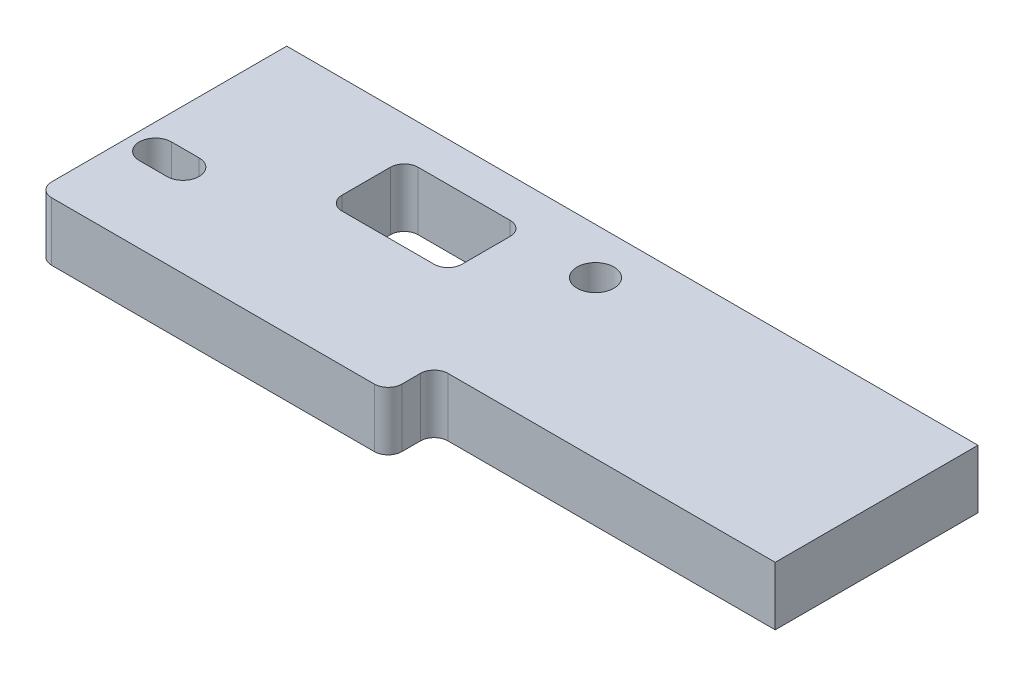
ISO-10303-21;
HEADER;
FILE_DESCRIPTION(('STEP AP214'),'2;1');
FILE_NAME('part.step','',(''),(''),'','','');
FILE_SCHEMA(('AUTOMOTIVE_DESIGN { 1 0 10303 214 1 1 1 1 }'));
ENDSEC;
DATA;
#1=APPLICATION_CONTEXT('core data for automotive mechanical design processes');
#2=APPLICATION_PROTOCOL_DEFINITION('international standard','automotive_design',2000,#1);
#3=PRODUCT_CONTEXT('',#1,'mechanical');
#4=PRODUCT('Part','Part','',(#3));
#5=PRODUCT_RELATED_PRODUCT_CATEGORY('part','',(#4));
#6=PRODUCT_DEFINITION_FORMATION('','',#4);
#7=PRODUCT_DEFINITION_CONTEXT('part definition',#1,'design');
#8=PRODUCT_DEFINITION('design','',#6,#7);
#9=PRODUCT_DEFINITION_SHAPE('','',#8);
#10=(LENGTH_UNIT() NAMED_UNIT(*) SI_UNIT(.MILLI.,.METRE.));
#11=(NAMED_UNIT(*) PLANE_ANGLE_UNIT() SI_UNIT($,.RADIAN.));
#12=(NAMED_UNIT(*) SI_UNIT($,.STERADIAN.) SOLID_ANGLE_UNIT());
#13=UNCERTAINTY_MEASURE_WITH_UNIT(LENGTH_MEASURE(1.E-05),#10,'distance_accuracy_value','');
#14=(GEOMETRIC_REPRESENTATION_CONTEXT(3) GLOBAL_UNCERTAINTY_ASSIGNED_CONTEXT((#13)) GLOBAL_UNIT_ASSIGNED_CONTEXT((#10,
#11,#12)) REPRESENTATION_CONTEXT('',''));
#15=CARTESIAN_POINT('',(0.,0.,0.));
#16=DIRECTION('',(0.,0.,1.));
#17=DIRECTION('',(1.,0.,0.));
#18=AXIS2_PLACEMENT_3D('',#15,#16,#17);
#19=CARTESIAN_POINT('',(5.75,6.35,-10.));
#20=DIRECTION('',(0.,-1.,0.));
#21=DIRECTION('',(0.,0.,-1.));
#22=AXIS2_PLACEMENT_3D('',#19,#20,#21);
#23=CYLINDRICAL_SURFACE('',#22,1.75);
#24=CARTESIAN_POINT('',(5.75,0.,-10.));
#25=DIRECTION('',(0.,1.,0.));
#26=DIRECTION('',(0.,0.,1.));
#27=AXIS2_PLACEMENT_3D('',#24,#25,#26);
#28=CIRCLE('',#27,1.75);
#29=CARTESIAN_POINT('',(5.75,0.,-8.25));
#30=VERTEX_POINT('',#29);
#31=CARTESIAN_POINT('',(5.75,0.,-11.75));
#32=VERTEX_POINT('',#31);
#33=EDGE_CURVE('E221',#30,#32,#28,.T.);
#34=ORIENTED_EDGE('',*,*,#33,.F.);
#35=DIRECTION('',(0.,-1.,0.));
#36=VECTOR('',#35,1.);
#37=CARTESIAN_POINT('',(5.75,6.35,-8.25));
#38=LINE('',#37,#36);
#39=CARTESIAN_POINT('',(5.75,6.35,-8.25));
#40=VERTEX_POINT('',#39);
#41=EDGE_CURVE('E230',#40,#30,#38,.T.);
#42=ORIENTED_EDGE('',*,*,#41,.F.);
#43=CARTESIAN_POINT('',(5.75,6.35,-10.));
#44=DIRECTION('',(0.,1.,0.));
#45=DIRECTION('',(0.,0.,1.));
#46=AXIS2_PLACEMENT_3D('',#43,#44,#45);
#47=CIRCLE('',#46,1.75);
#48=CARTESIAN_POINT('',(5.75,6.35,-11.75));
#49=VERTEX_POINT('',#48);
#50=EDGE_CURVE('E210',#40,#49,#47,.T.);
#51=ORIENTED_EDGE('',*,*,#50,.T.);
#52=DIRECTION('',(0.,-1.,0.));
#53=VECTOR('',#52,1.);
#54=CARTESIAN_POINT('',(5.75,6.35,-11.75));
#55=LINE('',#54,#53);
#56=EDGE_CURVE('E228',#49,#32,#55,.T.);
#57=ORIENTED_EDGE('',*,*,#56,.T.);
#58=EDGE_LOOP('',(#34,#42,#51,#57));
#59=FACE_BOUND('',#58,.T.);
#60=ADVANCED_FACE('F32',(#59),#23,.F.);
#61=CARTESIAN_POINT('',(2.75,6.35,-8.25));
#62=DIRECTION('',(0.,0.,-1.));
#63=DIRECTION('',(-1.,0.,0.));
#64=AXIS2_PLACEMENT_3D('',#61,#62,#63);
#65=PLANE('',#64);
#66=DIRECTION('',(1.,0.,0.));
#67=VECTOR('',#66,1.);
#68=CARTESIAN_POINT('',(2.75,0.,-8.25));
#69=LINE('',#68,#67);
#70=CARTESIAN_POINT('',(2.75,0.,-8.25));
#71=VERTEX_POINT('',#70);
#72=EDGE_CURVE('E218',#71,#30,#69,.T.);
#73=ORIENTED_EDGE('',*,*,#72,.F.);
#74=DIRECTION('',(0.,-1.,0.));
#75=VECTOR('',#74,1.);
#76=CARTESIAN_POINT('',(2.75,6.35,-8.25));
#77=LINE('',#76,#75);
#78=CARTESIAN_POINT('',(2.75,6.35,-8.25));
#79=VERTEX_POINT('',#78);
#80=EDGE_CURVE('E232',#79,#71,#77,.T.);
#81=ORIENTED_EDGE('',*,*,#80,.F.);
#82=DIRECTION('',(1.,0.,0.));
#83=VECTOR('',#82,1.);
#84=CARTESIAN_POINT('',(2.75,6.35,-8.25));
#85=LINE('',#84,#83);
#86=EDGE_CURVE('E207',#79,#40,#85,.T.);
#87=ORIENTED_EDGE('',*,*,#86,.T.);
#88=ORIENTED_EDGE('',*,*,#41,.T.);
#89=EDGE_LOOP('',(#73,#81,#87,#88));
#90=FACE_BOUND('',#89,.T.);
#91=ADVANCED_FACE('F371',(#90),#65,.T.);
#92=CARTESIAN_POINT('',(2.75,6.35,-10.));
#93=DIRECTION('',(0.,-1.,0.));
#94=DIRECTION('',(0.,0.,-1.));
#95=AXIS2_PLACEMENT_3D('',#92,#93,#94);
#96=CYLINDRICAL_SURFACE('',#95,1.75);
#97=CARTESIAN_POINT('',(2.75,0.,-10.));
#98=DIRECTION('',(0.,1.,0.));
#99=DIRECTION('',(0.,0.,1.));
#100=AXIS2_PLACEMENT_3D('',#97,#98,#99);
#101=CIRCLE('',#100,1.75);
#102=CARTESIAN_POINT('',(2.75,0.,-11.75));
#103=VERTEX_POINT('',#102);
#104=EDGE_CURVE('E204',#103,#71,#101,.T.);
#105=ORIENTED_EDGE('',*,*,#104,.F.);
#106=DIRECTION('',(0.,-1.,0.));
#107=VECTOR('',#106,1.);
#108=CARTESIAN_POINT('',(2.75,6.35,-11.75));
#109=LINE('',#108,#107);
#110=CARTESIAN_POINT('',(2.75,6.35,-11.75));
#111=VERTEX_POINT('',#110);
#112=EDGE_CURVE('E215',#111,#103,#109,.T.);
#113=ORIENTED_EDGE('',*,*,#112,.F.);
#114=CARTESIAN_POINT('',(2.75,6.35,-10.));
#115=DIRECTION('',(0.,1.,0.));
#116=DIRECTION('',(0.,0.,1.));
#117=AXIS2_PLACEMENT_3D('',#114,#115,#116);
#118=CIRCLE('',#117,1.75);
#119=EDGE_CURVE('E205',#111,#79,#118,.T.);
#120=ORIENTED_EDGE('',*,*,#119,.T.);
#121=ORIENTED_EDGE('',*,*,#80,.T.);
#122=EDGE_LOOP('',(#105,#113,#120,#121));
#123=FACE_BOUND('',#122,.T.);
#124=ADVANCED_FACE('F378',(#123),#96,.F.);
#125=CARTESIAN_POINT('',(2.75,6.35,-11.75));
#126=DIRECTION('',(0.,0.,1.));
#127=DIRECTION('',(1.,0.,0.));
#128=AXIS2_PLACEMENT_3D('',#125,#126,#127);
#129=PLANE('',#128);
#130=DIRECTION('',(-1.,0.,0.));
#131=VECTOR('',#130,1.);
#132=CARTESIAN_POINT('',(2.75,0.,-11.75));
#133=LINE('',#132,#131);
#134=EDGE_CURVE('E208',#32,#103,#133,.T.);
#135=ORIENTED_EDGE('',*,*,#134,.F.);
#136=ORIENTED_EDGE('',*,*,#56,.F.);
#137=DIRECTION('',(-1.,0.,0.));
#138=VECTOR('',#137,1.);
#139=CARTESIAN_POINT('',(2.75,6.35,-11.75));
#140=LINE('',#139,#138);
#141=EDGE_CURVE('E213',#49,#111,#140,.T.);
#142=ORIENTED_EDGE('',*,*,#141,.T.);
#143=ORIENTED_EDGE('',*,*,#112,.T.);
#144=EDGE_LOOP('',(#135,#136,#142,#143));
#145=FACE_BOUND('',#144,.T.);
#146=ADVANCED_FACE('F383',(#145),#129,.T.);
#147=CARTESIAN_POINT('',(38.5,6.35,-22.));
#148=DIRECTION('',(0.,-1.,0.));
#149=DIRECTION('',(0.,0.,-1.));
#150=AXIS2_PLACEMENT_3D('',#147,#148,#149);
#151=CYLINDRICAL_SURFACE('',#150,2.);
#152=CARTESIAN_POINT('',(38.5,6.35,-22.));
#153=DIRECTION('',(0.,1.,0.));
#154=DIRECTION('',(0.,0.,1.));
#155=AXIS2_PLACEMENT_3D('',#152,#153,#154);
#156=CIRCLE('',#155,2.);
#157=CARTESIAN_POINT('',(38.5,6.35,-20.));
#158=VERTEX_POINT('',#157);
#159=EDGE_CURVE('E236',#158,#158,#156,.T.);
#160=ORIENTED_EDGE('',*,*,#159,.T.);
#161=EDGE_LOOP('',(#160));
#162=FACE_BOUND('',#161,.T.);
#163=CARTESIAN_POINT('',(38.5,0.,-22.));
#164=DIRECTION('',(0.,1.,0.));
#165=DIRECTION('',(0.,0.,1.));
#166=AXIS2_PLACEMENT_3D('',#163,#164,#165);
#167=CIRCLE('',#166,2.);
#168=CARTESIAN_POINT('',(38.5,0.,-20.));
#169=VERTEX_POINT('',#168);
#170=EDGE_CURVE('E235',#169,#169,#167,.T.);
#171=ORIENTED_EDGE('',*,*,#170,.F.);
#172=EDGE_LOOP('',(#171));
#173=FACE_BOUND('',#172,.T.);
#174=ADVANCED_FACE('F389',(#162,#173),#151,.F.);
#175=CARTESIAN_POINT('',(28.5,6.35,-16.));
#176=DIRECTION('',(0.,1.,0.));
#177=DIRECTION('',(0.,0.,1.));
#178=AXIS2_PLACEMENT_3D('',#175,#176,#177);
#179=CYLINDRICAL_SURFACE('',#178,1.5);
#180=CARTESIAN_POINT('',(28.5,6.35,-16.));
#181=DIRECTION('',(0.,-1.,0.));
#182=DIRECTION('',(0.,0.,-1.));
#183=AXIS2_PLACEMENT_3D('',#180,#181,#182);
#184=CIRCLE('',#183,1.5);
#185=CARTESIAN_POINT('',(30.,6.35,-16.));
#186=VERTEX_POINT('',#185);
#187=CARTESIAN_POINT('',(28.5,6.35,-14.5));
#188=VERTEX_POINT('',#187);
#189=EDGE_CURVE('E340',#186,#188,#184,.T.);
#190=ORIENTED_EDGE('',*,*,#189,.F.);
#191=DIRECTION('',(0.,-1.,0.));
#192=VECTOR('',#191,1.);
#193=CARTESIAN_POINT('',(30.,6.35,-16.));
#194=LINE('',#193,#192);
#195=CARTESIAN_POINT('',(30.,0.,-16.));
#196=VERTEX_POINT('',#195);
#197=EDGE_CURVE('E298',#196,#186,#194,.F.);
#198=ORIENTED_EDGE('',*,*,#197,.F.);
#199=CARTESIAN_POINT('',(28.5,0.,-16.));
#200=DIRECTION('',(0.,-1.,0.));
#201=DIRECTION('',(0.,0.,-1.));
#202=AXIS2_PLACEMENT_3D('',#199,#200,#201);
#203=CIRCLE('',#202,1.5);
#204=CARTESIAN_POINT('',(28.5,0.,-14.5));
#205=VERTEX_POINT('',#204);
#206=EDGE_CURVE('E338',#205,#196,#203,.F.);
#207=ORIENTED_EDGE('',*,*,#206,.F.);
#208=DIRECTION('',(0.,-1.,0.));
#209=VECTOR('',#208,1.);
#210=CARTESIAN_POINT('',(28.5,0.,-14.5));
#211=LINE('',#210,#209);
#212=EDGE_CURVE('E288',#188,#205,#211,.T.);
#213=ORIENTED_EDGE('',*,*,#212,.F.);
#214=EDGE_LOOP('',(#190,#198,#207,#213));
#215=FACE_BOUND('',#214,.T.);
#216=ADVANCED_FACE('F392',(#215),#179,.F.);
#217=CARTESIAN_POINT('',(17.,6.35,-14.5));
#218=DIRECTION('',(0.,0.,-1.));
#219=DIRECTION('',(-1.,0.,0.));
#220=AXIS2_PLACEMENT_3D('',#217,#218,#219);
#221=PLANE('',#220);
#222=DIRECTION('',(1.,0.,0.));
#223=VECTOR('',#222,1.);
#224=CARTESIAN_POINT('',(17.,0.,-14.5));
#225=LINE('',#224,#223);
#226=CARTESIAN_POINT('',(18.5,0.,-14.5));
#227=VERTEX_POINT('',#226);
#228=EDGE_CURVE('E257',#227,#205,#225,.T.);
#229=ORIENTED_EDGE('',*,*,#228,.F.);
#230=DIRECTION('',(0.,-1.,0.));
#231=VECTOR('',#230,1.);
#232=CARTESIAN_POINT('',(18.5,6.35,-14.5));
#233=LINE('',#232,#231);
#234=CARTESIAN_POINT('',(18.5,6.35,-14.5));
#235=VERTEX_POINT('',#234);
#236=EDGE_CURVE('E291',#227,#235,#233,.F.);
#237=ORIENTED_EDGE('',*,*,#236,.T.);
#238=DIRECTION('',(1.,0.,0.));
#239=VECTOR('',#238,1.);
#240=CARTESIAN_POINT('',(17.,6.35,-14.5));
#241=LINE('',#240,#239);
#242=EDGE_CURVE('E245',#235,#188,#241,.T.);
#243=ORIENTED_EDGE('',*,*,#242,.T.);
#244=ORIENTED_EDGE('',*,*,#212,.T.);
#245=EDGE_LOOP('',(#229,#237,#243,#244));
#246=FACE_BOUND('',#245,.T.);
#247=ADVANCED_FACE('F405',(#246),#221,.T.);
#248=CARTESIAN_POINT('',(18.5,6.35,-16.));
#249=DIRECTION('',(0.,1.,0.));
#250=DIRECTION('',(0.,0.,1.));
#251=AXIS2_PLACEMENT_3D('',#248,#249,#250);
#252=CYLINDRICAL_SURFACE('',#251,1.5);
#253=CARTESIAN_POINT('',(18.5,6.35,-16.));
#254=DIRECTION('',(0.,-1.,0.));
#255=DIRECTION('',(0.,0.,-1.));
#256=AXIS2_PLACEMENT_3D('',#253,#254,#255);
#257=CIRCLE('',#256,1.5);
#258=CARTESIAN_POINT('',(17.,6.35,-16.));
#259=VERTEX_POINT('',#258);
#260=EDGE_CURVE('E328',#235,#259,#257,.T.);
#261=ORIENTED_EDGE('',*,*,#260,.F.);
#262=ORIENTED_EDGE('',*,*,#236,.F.);
#263=CARTESIAN_POINT('',(18.5,0.,-16.));
#264=DIRECTION('',(0.,-1.,0.));
#265=DIRECTION('',(0.,0.,-1.));
#266=AXIS2_PLACEMENT_3D('',#263,#264,#265);
#267=CIRCLE('',#266,1.5);
#268=CARTESIAN_POINT('',(17.,0.,-16.));
#269=VERTEX_POINT('',#268);
#270=EDGE_CURVE('E326',#269,#227,#267,.F.);
#271=ORIENTED_EDGE('',*,*,#270,.F.);
#272=DIRECTION('',(0.,-1.,0.));
#273=VECTOR('',#272,1.);
#274=CARTESIAN_POINT('',(17.,0.,-16.));
#275=LINE('',#274,#273);
#276=EDGE_CURVE('E285',#259,#269,#275,.T.);
#277=ORIENTED_EDGE('',*,*,#276,.F.);
#278=EDGE_LOOP('',(#261,#262,#271,#277));
#279=FACE_BOUND('',#278,.T.);
#280=ADVANCED_FACE('F408',(#279),#252,.F.);
#281=CARTESIAN_POINT('',(17.,6.35,-22.75));
#282=DIRECTION('',(1.,0.,0.));
#283=DIRECTION('',(0.,0.,-1.));
#284=AXIS2_PLACEMENT_3D('',#281,#282,#283);
#285=PLANE('',#284);
#286=DIRECTION('',(0.,0.,1.));
#287=VECTOR('',#286,1.);
#288=CARTESIAN_POINT('',(17.,6.35,-22.75));
#289=LINE('',#288,#287);
#290=CARTESIAN_POINT('',(17.,6.35,-21.25));
#291=VERTEX_POINT('',#290);
#292=EDGE_CURVE('E242',#291,#259,#289,.T.);
#293=ORIENTED_EDGE('',*,*,#292,.T.);
#294=ORIENTED_EDGE('',*,*,#276,.T.);
#295=DIRECTION('',(0.,0.,1.));
#296=VECTOR('',#295,1.);
#297=CARTESIAN_POINT('',(17.,0.,-22.75));
#298=LINE('',#297,#296);
#299=CARTESIAN_POINT('',(17.,0.,-21.25));
#300=VERTEX_POINT('',#299);
#301=EDGE_CURVE('E239',#300,#269,#298,.T.);
#302=ORIENTED_EDGE('',*,*,#301,.F.);
#303=DIRECTION('',(0.,-1.,0.));
#304=VECTOR('',#303,1.);
#305=CARTESIAN_POINT('',(17.,6.35,-21.25));
#306=LINE('',#305,#304);
#307=EDGE_CURVE('E276',#300,#291,#306,.F.);
#308=ORIENTED_EDGE('',*,*,#307,.T.);
#309=EDGE_LOOP('',(#293,#294,#302,#308));
#310=FACE_BOUND('',#309,.T.);
#311=ADVANCED_FACE('F410',(#310),#285,.T.);
#312=CARTESIAN_POINT('',(18.5,6.35,-21.25));
#313=DIRECTION('',(0.,1.,0.));
#314=DIRECTION('',(0.,0.,1.));
#315=AXIS2_PLACEMENT_3D('',#312,#313,#314);
#316=CYLINDRICAL_SURFACE('',#315,1.5);
#317=CARTESIAN_POINT('',(18.5,6.35,-21.25));
#318=DIRECTION('',(0.,-1.,0.));
#319=DIRECTION('',(0.,0.,-1.));
#320=AXIS2_PLACEMENT_3D('',#317,#318,#319);
#321=CIRCLE('',#320,1.5);
#322=CARTESIAN_POINT('',(18.5,6.35,-22.75));
#323=VERTEX_POINT('',#322);
#324=EDGE_CURVE('E332',#291,#323,#321,.T.);
#325=ORIENTED_EDGE('',*,*,#324,.F.);
#326=ORIENTED_EDGE('',*,*,#307,.F.);
#327=CARTESIAN_POINT('',(18.5,0.,-21.25));
#328=DIRECTION('',(0.,-1.,0.));
#329=DIRECTION('',(0.,0.,-1.));
#330=AXIS2_PLACEMENT_3D('',#327,#328,#329);
#331=CIRCLE('',#330,1.5);
#332=CARTESIAN_POINT('',(18.5,0.,-22.75));
#333=VERTEX_POINT('',#332);
#334=EDGE_CURVE('E330',#333,#300,#331,.F.);
#335=ORIENTED_EDGE('',*,*,#334,.F.);
#336=DIRECTION('',(0.,-1.,0.));
#337=VECTOR('',#336,1.);
#338=CARTESIAN_POINT('',(18.5,0.,-22.75));
#339=LINE('',#338,#337);
#340=EDGE_CURVE('E295',#323,#333,#339,.T.);
#341=ORIENTED_EDGE('',*,*,#340,.F.);
#342=EDGE_LOOP('',(#325,#326,#335,#341));
#343=FACE_BOUND('',#342,.T.);
#344=ADVANCED_FACE('F398',(#343),#316,.F.);
#345=CARTESIAN_POINT('',(17.,6.35,-22.75));
#346=DIRECTION('',(0.,0.,1.));
#347=DIRECTION('',(1.,0.,0.));
#348=AXIS2_PLACEMENT_3D('',#345,#346,#347);
#349=PLANE('',#348);
#350=DIRECTION('',(-1.,0.,0.));
#351=VECTOR('',#350,1.);
#352=CARTESIAN_POINT('',(17.,6.35,-22.75));
#353=LINE('',#352,#351);
#354=CARTESIAN_POINT('',(28.5,6.35,-22.75));
#355=VERTEX_POINT('',#354);
#356=EDGE_CURVE('E252',#355,#323,#353,.T.);
#357=ORIENTED_EDGE('',*,*,#356,.T.);
#358=ORIENTED_EDGE('',*,*,#340,.T.);
#359=DIRECTION('',(-1.,0.,0.));
#360=VECTOR('',#359,1.);
#361=CARTESIAN_POINT('',(17.,0.,-22.75));
#362=LINE('',#361,#360);
#363=CARTESIAN_POINT('',(28.5,0.,-22.75));
#364=VERTEX_POINT('',#363);
#365=EDGE_CURVE('E246',#364,#333,#362,.T.);
#366=ORIENTED_EDGE('',*,*,#365,.F.);
#367=DIRECTION('',(0.,-1.,0.));
#368=VECTOR('',#367,1.);
#369=CARTESIAN_POINT('',(28.5,6.35,-22.75));
#370=LINE('',#369,#368);
#371=EDGE_CURVE('E293',#364,#355,#370,.F.);
#372=ORIENTED_EDGE('',*,*,#371,.T.);
#373=EDGE_LOOP('',(#357,#358,#366,#372));
#374=FACE_BOUND('',#373,.T.);
#375=ADVANCED_FACE('F394',(#374),#349,.T.);
#376=CARTESIAN_POINT('',(28.5,6.35,-21.25));
#377=DIRECTION('',(0.,1.,0.));
#378=DIRECTION('',(0.,0.,1.));
#379=AXIS2_PLACEMENT_3D('',#376,#377,#378);
#380=CYLINDRICAL_SURFACE('',#379,1.5);
#381=CARTESIAN_POINT('',(28.5,6.35,-21.25));
#382=DIRECTION('',(0.,-1.,0.));
#383=DIRECTION('',(0.,0.,-1.));
#384=AXIS2_PLACEMENT_3D('',#381,#382,#383);
#385=CIRCLE('',#384,1.5);
#386=CARTESIAN_POINT('',(30.,6.35,-21.25));
#387=VERTEX_POINT('',#386);
#388=EDGE_CURVE('E336',#355,#387,#385,.T.);
#389=ORIENTED_EDGE('',*,*,#388,.F.);
#390=ORIENTED_EDGE('',*,*,#371,.F.);
#391=CARTESIAN_POINT('',(28.5,0.,-21.25));
#392=DIRECTION('',(0.,-1.,0.));
#393=DIRECTION('',(0.,0.,-1.));
#394=AXIS2_PLACEMENT_3D('',#391,#392,#393);
#395=CIRCLE('',#394,1.5);
#396=CARTESIAN_POINT('',(30.,0.,-21.25));
#397=VERTEX_POINT('',#396);
#398=EDGE_CURVE('E334',#397,#364,#395,.F.);
#399=ORIENTED_EDGE('',*,*,#398,.F.);
#400=DIRECTION('',(0.,-1.,0.));
#401=VECTOR('',#400,1.);
#402=CARTESIAN_POINT('',(30.,0.,-21.25));
#403=LINE('',#402,#401);
#404=EDGE_CURVE('E300',#387,#397,#403,.T.);
#405=ORIENTED_EDGE('',*,*,#404,.F.);
#406=EDGE_LOOP('',(#389,#390,#399,#405));
#407=FACE_BOUND('',#406,.T.);
#408=ADVANCED_FACE('F397',(#407),#380,.F.);
#409=CARTESIAN_POINT('',(30.,6.35,-22.75));
#410=DIRECTION('',(-1.,0.,0.));
#411=DIRECTION('',(0.,0.,1.));
#412=AXIS2_PLACEMENT_3D('',#409,#410,#411);
#413=PLANE('',#412);
#414=DIRECTION('',(0.,0.,-1.));
#415=VECTOR('',#414,1.);
#416=CARTESIAN_POINT('',(30.,6.35,-22.75));
#417=LINE('',#416,#415);
#418=EDGE_CURVE('E249',#186,#387,#417,.T.);
#419=ORIENTED_EDGE('',*,*,#418,.T.);
#420=ORIENTED_EDGE('',*,*,#404,.T.);
#421=DIRECTION('',(0.,0.,-1.));
#422=VECTOR('',#421,1.);
#423=CARTESIAN_POINT('',(30.,0.,-22.75));
#424=LINE('',#423,#422);
#425=EDGE_CURVE('E260',#196,#397,#424,.T.);
#426=ORIENTED_EDGE('',*,*,#425,.F.);
#427=ORIENTED_EDGE('',*,*,#197,.T.);
#428=EDGE_LOOP('',(#419,#420,#426,#427));
#429=FACE_BOUND('',#428,.T.);
#430=ADVANCED_FACE('F400',(#429),#413,.T.);
#431=CARTESIAN_POINT('',(0.,6.35,0.));
#432=DIRECTION('',(0.,0.,-1.));
#433=DIRECTION('',(-1.,0.,0.));
#434=AXIS2_PLACEMENT_3D('',#431,#432,#433);
#435=PLANE('',#434);
#436=DIRECTION('',(1.,0.,0.));
#437=VECTOR('',#436,1.);
#438=CARTESIAN_POINT('',(0.,6.35,0.));
#439=LINE('',#438,#437);
#440=CARTESIAN_POINT('',(1.5,6.35,0.));
#441=VERTEX_POINT('',#440);
#442=CARTESIAN_POINT('',(36.5,6.35,0.));
#443=VERTEX_POINT('',#442);
#444=EDGE_CURVE('E267',#441,#443,#439,.T.);
#445=ORIENTED_EDGE('',*,*,#444,.F.);
#446=DIRECTION('',(0.,-1.,0.));
#447=VECTOR('',#446,1.);
#448=CARTESIAN_POINT('',(1.5,6.35,0.));
#449=LINE('',#448,#447);
#450=CARTESIAN_POINT('',(1.5,0.,0.));
#451=VERTEX_POINT('',#450);
#452=EDGE_CURVE('E323',#441,#451,#449,.T.);
#453=ORIENTED_EDGE('',*,*,#452,.T.);
#454=DIRECTION('',(1.,0.,0.));
#455=VECTOR('',#454,1.);
#456=CARTESIAN_POINT('',(0.,0.,0.));
#457=LINE('',#456,#455);
#458=CARTESIAN_POINT('',(36.5,0.,0.));
#459=VERTEX_POINT('',#458);
#460=EDGE_CURVE('E278',#451,#459,#457,.T.);
#461=ORIENTED_EDGE('',*,*,#460,.T.);
#462=DIRECTION('',(0.,-1.,0.));
#463=VECTOR('',#462,1.);
#464=CARTESIAN_POINT('',(36.5,6.35,0.));
#465=LINE('',#464,#463);
#466=EDGE_CURVE('E55',#459,#443,#465,.F.);
#467=ORIENTED_EDGE('',*,*,#466,.T.);
#468=EDGE_LOOP('',(#445,#453,#461,#467));
#469=FACE_BOUND('',#468,.T.);
#470=ADVANCED_FACE('F403',(#469),#435,.F.);
#471=CARTESIAN_POINT('',(36.5,6.35,-1.5));
#472=DIRECTION('',(0.,-1.,0.));
#473=DIRECTION('',(0.,0.,-1.));
#474=AXIS2_PLACEMENT_3D('',#471,#472,#473);
#475=CYLINDRICAL_SURFACE('',#474,1.5);
#476=CARTESIAN_POINT('',(36.5,6.35,-1.5));
#477=DIRECTION('',(0.,-1.,0.));
#478=DIRECTION('',(0.,0.,-1.));
#479=AXIS2_PLACEMENT_3D('',#476,#477,#478);
#480=CIRCLE('',#479,1.5);
#481=CARTESIAN_POINT('',(38.,6.35,-1.5));
#482=VERTEX_POINT('',#481);
#483=EDGE_CURVE('E315',#443,#482,#480,.F.);
#484=ORIENTED_EDGE('',*,*,#483,.F.);
#485=ORIENTED_EDGE('',*,*,#466,.F.);
#486=CARTESIAN_POINT('',(36.5,0.,-1.5));
#487=DIRECTION('',(0.,-1.,0.));
#488=DIRECTION('',(0.,0.,-1.));
#489=AXIS2_PLACEMENT_3D('',#486,#487,#488);
#490=CIRCLE('',#489,1.5);
#491=CARTESIAN_POINT('',(38.,0.,-1.5));
#492=VERTEX_POINT('',#491);
#493=EDGE_CURVE('E311',#492,#459,#490,.T.);
#494=ORIENTED_EDGE('',*,*,#493,.F.);
#495=DIRECTION('',(0.,-1.,0.));
#496=VECTOR('',#495,1.);
#497=CARTESIAN_POINT('',(38.,6.35,-1.5));
#498=LINE('',#497,#496);
#499=EDGE_CURVE('E306',#482,#492,#498,.T.);
#500=ORIENTED_EDGE('',*,*,#499,.F.);
#501=EDGE_LOOP('',(#484,#485,#494,#500));
#502=FACE_BOUND('',#501,.T.);
#503=ADVANCED_FACE('F34',(#502),#475,.T.);
#504=CARTESIAN_POINT('',(38.,6.35,0.));
#505=DIRECTION('',(-1.,0.,0.));
#506=DIRECTION('',(0.,0.,1.));
#507=AXIS2_PLACEMENT_3D('',#504,#505,#506);
#508=PLANE('',#507);
#509=DIRECTION('',(0.,0.,-1.));
#510=VECTOR('',#509,1.);
#511=CARTESIAN_POINT('',(38.,0.,0.));
#512=LINE('',#511,#510);
#513=CARTESIAN_POINT('',(38.,0.,-3.5));
#514=VERTEX_POINT('',#513);
#515=EDGE_CURVE('E280',#492,#514,#512,.T.);
#516=ORIENTED_EDGE('',*,*,#515,.T.);
#517=DIRECTION('',(0.,-1.,0.));
#518=VECTOR('',#517,1.);
#519=CARTESIAN_POINT('',(38.,6.35,-3.5));
#520=LINE('',#519,#518);
#521=CARTESIAN_POINT('',(38.,6.35,-3.5));
#522=VERTEX_POINT('',#521);
#523=EDGE_CURVE('E309',#514,#522,#520,.F.);
#524=ORIENTED_EDGE('',*,*,#523,.T.);
#525=DIRECTION('',(0.,0.,-1.));
#526=VECTOR('',#525,1.);
#527=CARTESIAN_POINT('',(38.,6.35,0.));
#528=LINE('',#527,#526);
#529=EDGE_CURVE('E270',#482,#522,#528,.T.);
#530=ORIENTED_EDGE('',*,*,#529,.F.);
#531=ORIENTED_EDGE('',*,*,#499,.T.);
#532=EDGE_LOOP('',(#516,#524,#530,#531));
#533=FACE_BOUND('',#532,.T.);
#534=ADVANCED_FACE('F346',(#533),#508,.F.);
#535=CARTESIAN_POINT('',(39.5,6.35,-3.5));
#536=DIRECTION('',(0.,1.,0.));
#537=DIRECTION('',(0.,0.,1.));
#538=AXIS2_PLACEMENT_3D('',#535,#536,#537);
#539=CYLINDRICAL_SURFACE('',#538,1.5);
#540=CARTESIAN_POINT('',(39.5,6.35,-3.5));
#541=DIRECTION('',(0.,-1.,0.));
#542=DIRECTION('',(0.,0.,-1.));
#543=AXIS2_PLACEMENT_3D('',#540,#541,#542);
#544=CIRCLE('',#543,1.5);
#545=CARTESIAN_POINT('',(39.5,6.35,-5.));
#546=VERTEX_POINT('',#545);
#547=EDGE_CURVE('E11',#522,#546,#544,.T.);
#548=ORIENTED_EDGE('',*,*,#547,.F.);
#549=ORIENTED_EDGE('',*,*,#523,.F.);
#550=CARTESIAN_POINT('',(39.5,0.,-3.5));
#551=DIRECTION('',(0.,-1.,0.));
#552=DIRECTION('',(0.,0.,-1.));
#553=AXIS2_PLACEMENT_3D('',#550,#551,#552);
#554=CIRCLE('',#553,1.5);
#555=CARTESIAN_POINT('',(39.5,0.,-5.));
#556=VERTEX_POINT('',#555);
#557=EDGE_CURVE('E40',#556,#514,#554,.F.);
#558=ORIENTED_EDGE('',*,*,#557,.F.);
#559=DIRECTION('',(0.,-1.,0.));
#560=VECTOR('',#559,1.);
#561=CARTESIAN_POINT('',(39.5,0.,-5.));
#562=LINE('',#561,#560);
#563=EDGE_CURVE('E303',#546,#556,#562,.T.);
#564=ORIENTED_EDGE('',*,*,#563,.F.);
#565=EDGE_LOOP('',(#548,#549,#558,#564));
#566=FACE_BOUND('',#565,.T.);
#567=ADVANCED_FACE('F350',(#566),#539,.F.);
#568=CARTESIAN_POINT('',(1.5,6.35,-1.5));
#569=DIRECTION('',(0.,-1.,0.));
#570=DIRECTION('',(0.,0.,-1.));
#571=AXIS2_PLACEMENT_3D('',#568,#569,#570);
#572=CYLINDRICAL_SURFACE('',#571,1.5);
#573=CARTESIAN_POINT('',(1.5,6.35,-1.5));
#574=DIRECTION('',(0.,-1.,0.));
#575=DIRECTION('',(0.,0.,-1.));
#576=AXIS2_PLACEMENT_3D('',#573,#574,#575);
#577=CIRCLE('',#576,1.5);
#578=CARTESIAN_POINT('',(0.,6.35,-1.5));
#579=VERTEX_POINT('',#578);
#580=EDGE_CURVE('E317',#579,#441,#577,.F.);
#581=ORIENTED_EDGE('',*,*,#580,.F.);
#582=DIRECTION('',(0.,-1.,0.));
#583=VECTOR('',#582,1.);
#584=CARTESIAN_POINT('',(0.,6.35,-1.5));
#585=LINE('',#584,#583);
#586=CARTESIAN_POINT('',(0.,0.,-1.5));
#587=VERTEX_POINT('',#586);
#588=EDGE_CURVE('E319',#587,#579,#585,.F.);
#589=ORIENTED_EDGE('',*,*,#588,.F.);
#590=CARTESIAN_POINT('',(1.5,0.,-1.5));
#591=DIRECTION('',(0.,-1.,0.));
#592=DIRECTION('',(0.,0.,-1.));
#593=AXIS2_PLACEMENT_3D('',#590,#591,#592);
#594=CIRCLE('',#593,1.5);
#595=EDGE_CURVE('E313',#451,#587,#594,.T.);
#596=ORIENTED_EDGE('',*,*,#595,.F.);
#597=ORIENTED_EDGE('',*,*,#452,.F.);
#598=EDGE_LOOP('',(#581,#589,#596,#597));
#599=FACE_BOUND('',#598,.T.);
#600=ADVANCED_FACE('F358',(#599),#572,.T.);
#601=CARTESIAN_POINT('',(38.,6.35,-5.));
#602=DIRECTION('',(0.,0.,-1.));
#603=DIRECTION('',(-1.,0.,0.));
#604=AXIS2_PLACEMENT_3D('',#601,#602,#603);
#605=PLANE('',#604);
#606=DIRECTION('',(0.,-1.,0.));
#607=VECTOR('',#606,1.);
#608=CARTESIAN_POINT('',(75.,6.35,-5.));
#609=LINE('',#608,#607);
#610=CARTESIAN_POINT('',(75.,6.35,-5.));
#611=VERTEX_POINT('',#610);
#612=CARTESIAN_POINT('',(75.,0.,-5.));
#613=VERTEX_POINT('',#612);
#614=EDGE_CURVE('E195',#611,#613,#609,.T.);
#615=ORIENTED_EDGE('',*,*,#614,.F.);
#616=DIRECTION('',(1.,0.,0.));
#617=VECTOR('',#616,1.);
#618=CARTESIAN_POINT('',(38.,6.35,-5.));
#619=LINE('',#618,#617);
#620=EDGE_CURVE('E273',#546,#611,#619,.T.);
#621=ORIENTED_EDGE('',*,*,#620,.F.);
#622=ORIENTED_EDGE('',*,*,#563,.T.);
#623=DIRECTION('',(1.,0.,0.));
#624=VECTOR('',#623,1.);
#625=CARTESIAN_POINT('',(38.,0.,-5.));
#626=LINE('',#625,#624);
#627=EDGE_CURVE('E268',#556,#613,#626,.T.);
#628=ORIENTED_EDGE('',*,*,#627,.T.);
#629=EDGE_LOOP('',(#615,#621,#622,#628));
#630=FACE_BOUND('',#629,.T.);
#631=ADVANCED_FACE('F355',(#630),#605,.F.);
#632=CARTESIAN_POINT('',(0.,6.35,0.));
#633=DIRECTION('',(1.,0.,0.));
#634=DIRECTION('',(0.,0.,-1.));
#635=AXIS2_PLACEMENT_3D('',#632,#633,#634);
#636=PLANE('',#635);
#637=DIRECTION('',(0.,0.,1.));
#638=VECTOR('',#637,1.);
#639=CARTESIAN_POINT('',(0.,6.35,0.));
#640=LINE('',#639,#638);
#641=CARTESIAN_POINT('',(0.,6.35,-27.));
#642=VERTEX_POINT('',#641);
#643=EDGE_CURVE('E265',#642,#579,#640,.T.);
#644=ORIENTED_EDGE('',*,*,#643,.F.);
#645=DIRECTION('',(0.,-1.,0.));
#646=VECTOR('',#645,1.);
#647=CARTESIAN_POINT('',(0.,6.35,-27.));
#648=LINE('',#647,#646);
#649=CARTESIAN_POINT('',(0.,0.,-27.));
#650=VERTEX_POINT('',#649);
#651=EDGE_CURVE('E191',#642,#650,#648,.T.);
#652=ORIENTED_EDGE('',*,*,#651,.T.);
#653=DIRECTION('',(0.,0.,1.));
#654=VECTOR('',#653,1.);
#655=CARTESIAN_POINT('',(0.,0.,0.));
#656=LINE('',#655,#654);
#657=EDGE_CURVE('E190',#650,#587,#656,.T.);
#658=ORIENTED_EDGE('',*,*,#657,.T.);
#659=ORIENTED_EDGE('',*,*,#588,.T.);
#660=EDGE_LOOP('',(#644,#652,#658,#659));
#661=FACE_BOUND('',#660,.T.);
#662=ADVANCED_FACE('F357',(#661),#636,.F.);
#663=CARTESIAN_POINT('',(75.,0.,0.));
#664=DIRECTION('',(1.,0.,0.));
#665=DIRECTION('',(0.,0.,-1.));
#666=AXIS2_PLACEMENT_3D('',#663,#664,#665);
#667=PLANE('',#666);
#668=DIRECTION('',(0.,-1.,0.));
#669=VECTOR('',#668,1.);
#670=CARTESIAN_POINT('',(75.,6.35,-27.));
#671=LINE('',#670,#669);
#672=CARTESIAN_POINT('',(75.,6.35,-27.));
#673=VERTEX_POINT('',#672);
#674=CARTESIAN_POINT('',(75.,0.,-27.));
#675=VERTEX_POINT('',#674);
#676=EDGE_CURVE('E173',#673,#675,#671,.T.);
#677=ORIENTED_EDGE('',*,*,#676,.F.);
#678=DIRECTION('',(0.,0.,1.));
#679=VECTOR('',#678,1.);
#680=CARTESIAN_POINT('',(75.,6.35,0.));
#681=LINE('',#680,#679);
#682=EDGE_CURVE('E197',#673,#611,#681,.T.);
#683=ORIENTED_EDGE('',*,*,#682,.T.);
#684=ORIENTED_EDGE('',*,*,#614,.T.);
#685=DIRECTION('',(0.,0.,1.));
#686=VECTOR('',#685,1.);
#687=CARTESIAN_POINT('',(75.,0.,0.));
#688=LINE('',#687,#686);
#689=EDGE_CURVE('E187',#675,#613,#688,.T.);
#690=ORIENTED_EDGE('',*,*,#689,.F.);
#691=EDGE_LOOP('',(#677,#683,#684,#690));
#692=FACE_BOUND('',#691,.T.);
#693=ADVANCED_FACE('F193',(#692),#667,.T.);
#694=CARTESIAN_POINT('',(0.,0.,0.));
#695=DIRECTION('',(0.,-1.,0.));
#696=DIRECTION('',(0.,0.,-1.));
#697=AXIS2_PLACEMENT_3D('',#694,#695,#696);
#698=PLANE('',#697);
#699=DIRECTION('',(1.,0.,0.));
#700=VECTOR('',#699,1.);
#701=CARTESIAN_POINT('',(-15.,0.,-27.));
#702=LINE('',#701,#700);
#703=EDGE_CURVE('E176',#650,#675,#702,.T.);
#704=ORIENTED_EDGE('',*,*,#703,.T.);
#705=ORIENTED_EDGE('',*,*,#689,.T.);
#706=ORIENTED_EDGE('',*,*,#627,.F.);
#707=ORIENTED_EDGE('',*,*,#557,.T.);
#708=ORIENTED_EDGE('',*,*,#515,.F.);
#709=ORIENTED_EDGE('',*,*,#493,.T.);
#710=ORIENTED_EDGE('',*,*,#460,.F.);
#711=ORIENTED_EDGE('',*,*,#595,.T.);
#712=ORIENTED_EDGE('',*,*,#657,.F.);
#713=EDGE_LOOP('',(#704,#705,#706,#707,#708,#709,#710,#711,#712));
#714=FACE_BOUND('',#713,.T.);
#715=ORIENTED_EDGE('',*,*,#425,.T.);
#716=ORIENTED_EDGE('',*,*,#398,.T.);
#717=ORIENTED_EDGE('',*,*,#365,.T.);
#718=ORIENTED_EDGE('',*,*,#334,.T.);
#719=ORIENTED_EDGE('',*,*,#301,.T.);
#720=ORIENTED_EDGE('',*,*,#270,.T.);
#721=ORIENTED_EDGE('',*,*,#228,.T.);
#722=ORIENTED_EDGE('',*,*,#206,.T.);
#723=EDGE_LOOP('',(#715,#716,#717,#718,#719,#720,#721,#722));
#724=FACE_BOUND('',#723,.T.);
#725=ORIENTED_EDGE('',*,*,#170,.T.);
#726=EDGE_LOOP('',(#725));
#727=FACE_BOUND('',#726,.T.);
#728=ORIENTED_EDGE('',*,*,#134,.T.);
#729=ORIENTED_EDGE('',*,*,#104,.T.);
#730=ORIENTED_EDGE('',*,*,#72,.T.);
#731=ORIENTED_EDGE('',*,*,#33,.T.);
#732=EDGE_LOOP('',(#728,#729,#730,#731));
#733=FACE_BOUND('',#732,.T.);
#734=ADVANCED_FACE('F184',(#714,#724,#727,#733),#698,.T.);
#735=CARTESIAN_POINT('',(0.,6.35,0.));
#736=DIRECTION('',(0.,-1.,0.));
#737=DIRECTION('',(0.,0.,-1.));
#738=AXIS2_PLACEMENT_3D('',#735,#736,#737);
#739=PLANE('',#738);
#740=ORIENTED_EDGE('',*,*,#292,.F.);
#741=ORIENTED_EDGE('',*,*,#324,.T.);
#742=ORIENTED_EDGE('',*,*,#356,.F.);
#743=ORIENTED_EDGE('',*,*,#388,.T.);
#744=ORIENTED_EDGE('',*,*,#418,.F.);
#745=ORIENTED_EDGE('',*,*,#189,.T.);
#746=ORIENTED_EDGE('',*,*,#242,.F.);
#747=ORIENTED_EDGE('',*,*,#260,.T.);
#748=EDGE_LOOP('',(#740,#741,#742,#743,#744,#745,#746,#747));
#749=FACE_BOUND('',#748,.T.);
#750=ORIENTED_EDGE('',*,*,#159,.F.);
#751=EDGE_LOOP('',(#750));
#752=FACE_BOUND('',#751,.T.);
#753=ORIENTED_EDGE('',*,*,#119,.F.);
#754=ORIENTED_EDGE('',*,*,#141,.F.);
#755=ORIENTED_EDGE('',*,*,#50,.F.);
#756=ORIENTED_EDGE('',*,*,#86,.F.);
#757=EDGE_LOOP('',(#753,#754,#755,#756));
#758=FACE_BOUND('',#757,.T.);
#759=ORIENTED_EDGE('',*,*,#682,.F.);
#760=DIRECTION('',(1.,0.,0.));
#761=VECTOR('',#760,1.);
#762=CARTESIAN_POINT('',(-15.,6.35,-27.));
#763=LINE('',#762,#761);
#764=EDGE_CURVE('E47',#642,#673,#763,.T.);
#765=ORIENTED_EDGE('',*,*,#764,.F.);
#766=ORIENTED_EDGE('',*,*,#643,.T.);
#767=ORIENTED_EDGE('',*,*,#580,.T.);
#768=ORIENTED_EDGE('',*,*,#444,.T.);
#769=ORIENTED_EDGE('',*,*,#483,.T.);
#770=ORIENTED_EDGE('',*,*,#529,.T.);
#771=ORIENTED_EDGE('',*,*,#547,.T.);
#772=ORIENTED_EDGE('',*,*,#620,.T.);
#773=EDGE_LOOP('',(#759,#765,#766,#767,#768,#769,#770,#771,#772));
#774=FACE_BOUND('',#773,.T.);
#775=ADVANCED_FACE('F353',(#749,#752,#758,#774),#739,.F.);
#776=CARTESIAN_POINT('',(-15.,6.35,-27.));
#777=DIRECTION('',(0.,0.,1.));
#778=DIRECTION('',(1.,0.,0.));
#779=AXIS2_PLACEMENT_3D('',#776,#777,#778);
#780=PLANE('',#779);
#781=ORIENTED_EDGE('',*,*,#764,.T.);
#782=ORIENTED_EDGE('',*,*,#676,.T.);
#783=ORIENTED_EDGE('',*,*,#703,.F.);
#784=ORIENTED_EDGE('',*,*,#651,.F.);
#785=EDGE_LOOP('',(#781,#782,#783,#784));
#786=FACE_BOUND('',#785,.T.);
#787=ADVANCED_FACE('F175',(#786),#780,.F.);
#788=CLOSED_SHELL('',(#60,#91,#124,#146,#174,#216,#247,#280,#311,#344,#375,#408,#430,#470,#503,
#534,#567,#600,#631,#662,#693,#734,#775,#787));
#789=MANIFOLD_SOLID_BREP('B2',#788);
#790=ADVANCED_BREP_SHAPE_REPRESENTATION('',(#18,#789),#14);
#791=SHAPE_DEFINITION_REPRESENTATION(#9,#790);
ENDSEC;
END-ISO-10303-21;
